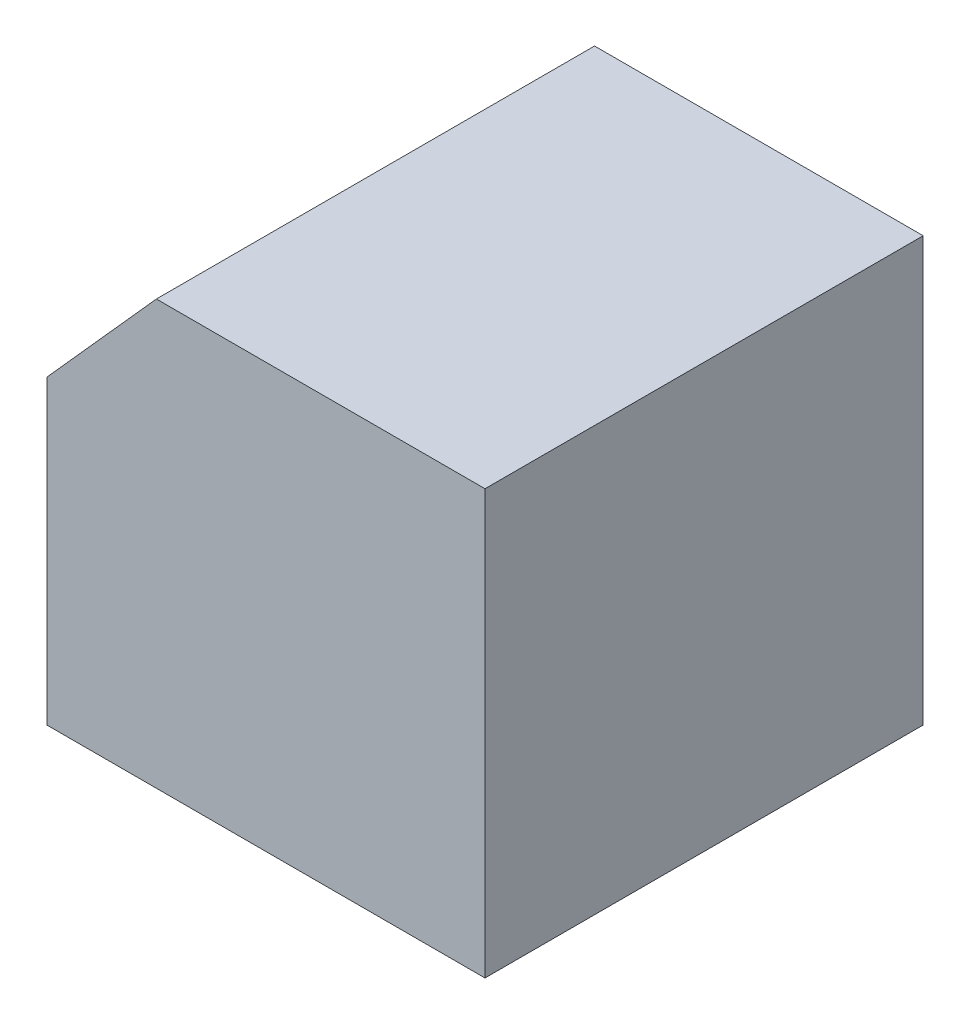
ISO-10303-21;
HEADER;
FILE_DESCRIPTION(('STEP AP214'),'2;1');
FILE_NAME('part.step','',(''),(''),'','','');
FILE_SCHEMA(('AUTOMOTIVE_DESIGN { 1 0 10303 214 1 1 1 1 }'));
ENDSEC;
DATA;
#1=APPLICATION_CONTEXT('core data for automotive mechanical design processes');
#2=APPLICATION_PROTOCOL_DEFINITION('international standard','automotive_design',2000,#1);
#3=PRODUCT_CONTEXT('',#1,'mechanical');
#4=PRODUCT('Part','Part','',(#3));
#5=PRODUCT_RELATED_PRODUCT_CATEGORY('part','',(#4));
#6=PRODUCT_DEFINITION_FORMATION('','',#4);
#7=PRODUCT_DEFINITION_CONTEXT('part definition',#1,'design');
#8=PRODUCT_DEFINITION('design','',#6,#7);
#9=PRODUCT_DEFINITION_SHAPE('','',#8);
#10=(LENGTH_UNIT() NAMED_UNIT(*) SI_UNIT(.MILLI.,.METRE.));
#11=(NAMED_UNIT(*) PLANE_ANGLE_UNIT() SI_UNIT($,.RADIAN.));
#12=(NAMED_UNIT(*) SI_UNIT($,.STERADIAN.) SOLID_ANGLE_UNIT());
#13=UNCERTAINTY_MEASURE_WITH_UNIT(LENGTH_MEASURE(1.E-05),#10,'distance_accuracy_value','');
#14=(GEOMETRIC_REPRESENTATION_CONTEXT(3) GLOBAL_UNCERTAINTY_ASSIGNED_CONTEXT((#13)) GLOBAL_UNIT_ASSIGNED_CONTEXT((#10,
#11,#12)) REPRESENTATION_CONTEXT('',''));
#15=CARTESIAN_POINT('',(0.,0.,0.));
#16=DIRECTION('',(0.,0.,1.));
#17=DIRECTION('',(1.,0.,0.));
#18=AXIS2_PLACEMENT_3D('',#15,#16,#17);
#19=CARTESIAN_POINT('',(101.6,392.992253256989,406.4));
#20=DIRECTION('',(0.74535599249993,-0.666666666666667,0.));
#21=DIRECTION('',(0.666666666666667,0.74535599249993,0.));
#22=AXIS2_PLACEMENT_3D('',#19,#20,#21);
#23=PLANE('',#22);
#24=DIRECTION('',(-0.666666666666667,-0.74535599249993,0.));
#25=VECTOR('',#24,1.);
#26=CARTESIAN_POINT('',(101.6,392.992253256989,0.));
#27=LINE('',#26,#25);
#28=CARTESIAN_POINT('',(101.6,392.992253256989,0.));
#29=VERTEX_POINT('',#28);
#30=CARTESIAN_POINT('',(0.,279.4,0.));
#31=VERTEX_POINT('',#30);
#32=EDGE_CURVE('E107',#29,#31,#27,.T.);
#33=ORIENTED_EDGE('',*,*,#32,.T.);
#34=DIRECTION('',(0.,0.,-1.));
#35=VECTOR('',#34,1.);
#36=CARTESIAN_POINT('',(0.,279.4,406.4));
#37=LINE('',#36,#35);
#38=CARTESIAN_POINT('',(0.,279.4,406.4));
#39=VERTEX_POINT('',#38);
#40=EDGE_CURVE('E11',#39,#31,#37,.T.);
#41=ORIENTED_EDGE('',*,*,#40,.F.);
#42=DIRECTION('',(-0.666666666666667,-0.74535599249993,0.));
#43=VECTOR('',#42,1.);
#44=CARTESIAN_POINT('',(101.6,392.992253256989,406.4));
#45=LINE('',#44,#43);
#46=CARTESIAN_POINT('',(101.6,392.992253256989,406.4));
#47=VERTEX_POINT('',#46);
#48=EDGE_CURVE('E115',#47,#39,#45,.T.);
#49=ORIENTED_EDGE('',*,*,#48,.F.);
#50=DIRECTION('',(0.,0.,-1.));
#51=VECTOR('',#50,1.);
#52=CARTESIAN_POINT('',(101.6,392.992253256989,406.4));
#53=LINE('',#52,#51);
#54=EDGE_CURVE('E103',#47,#29,#53,.T.);
#55=ORIENTED_EDGE('',*,*,#54,.T.);
#56=EDGE_LOOP('',(#33,#41,#49,#55));
#57=FACE_BOUND('',#56,.T.);
#58=ADVANCED_FACE('F33',(#57),#23,.F.);
#59=CARTESIAN_POINT('',(0.,279.4,406.4));
#60=DIRECTION('',(1.,0.,0.));
#61=DIRECTION('',(0.,1.,0.));
#62=AXIS2_PLACEMENT_3D('',#59,#60,#61);
#63=PLANE('',#62);
#64=DIRECTION('',(0.,-1.,0.));
#65=VECTOR('',#64,1.);
#66=CARTESIAN_POINT('',(0.,279.4,0.));
#67=LINE('',#66,#65);
#68=CARTESIAN_POINT('',(0.,0.,0.));
#69=VERTEX_POINT('',#68);
#70=EDGE_CURVE('E110',#31,#69,#67,.T.);
#71=ORIENTED_EDGE('',*,*,#70,.T.);
#72=DIRECTION('',(0.,0.,-1.));
#73=VECTOR('',#72,1.);
#74=CARTESIAN_POINT('',(0.,0.,406.4));
#75=LINE('',#74,#73);
#76=CARTESIAN_POINT('',(0.,0.,406.4));
#77=VERTEX_POINT('',#76);
#78=EDGE_CURVE('E41',#77,#69,#75,.T.);
#79=ORIENTED_EDGE('',*,*,#78,.F.);
#80=DIRECTION('',(0.,-1.,0.));
#81=VECTOR('',#80,1.);
#82=CARTESIAN_POINT('',(0.,279.4,406.4));
#83=LINE('',#82,#81);
#84=EDGE_CURVE('E83',#39,#77,#83,.T.);
#85=ORIENTED_EDGE('',*,*,#84,.F.);
#86=ORIENTED_EDGE('',*,*,#40,.T.);
#87=EDGE_LOOP('',(#71,#79,#85,#86));
#88=FACE_BOUND('',#87,.T.);
#89=ADVANCED_FACE('F134',(#88),#63,.F.);
#90=CARTESIAN_POINT('',(0.,0.,406.4));
#91=DIRECTION('',(0.,1.,0.));
#92=DIRECTION('',(0.,0.,1.));
#93=AXIS2_PLACEMENT_3D('',#90,#91,#92);
#94=PLANE('',#93);
#95=DIRECTION('',(1.,0.,0.));
#96=VECTOR('',#95,1.);
#97=CARTESIAN_POINT('',(0.,0.,0.));
#98=LINE('',#97,#96);
#99=CARTESIAN_POINT('',(406.4,0.,0.));
#100=VERTEX_POINT('',#99);
#101=EDGE_CURVE('E98',#69,#100,#98,.T.);
#102=ORIENTED_EDGE('',*,*,#101,.T.);
#103=DIRECTION('',(0.,0.,-1.));
#104=VECTOR('',#103,1.);
#105=CARTESIAN_POINT('',(406.4,0.,406.4));
#106=LINE('',#105,#104);
#107=CARTESIAN_POINT('',(406.4,0.,406.4));
#108=VERTEX_POINT('',#107);
#109=EDGE_CURVE('E95',#108,#100,#106,.T.);
#110=ORIENTED_EDGE('',*,*,#109,.F.);
#111=DIRECTION('',(1.,0.,0.));
#112=VECTOR('',#111,1.);
#113=CARTESIAN_POINT('',(0.,0.,406.4));
#114=LINE('',#113,#112);
#115=EDGE_CURVE('E87',#77,#108,#114,.T.);
#116=ORIENTED_EDGE('',*,*,#115,.F.);
#117=ORIENTED_EDGE('',*,*,#78,.T.);
#118=EDGE_LOOP('',(#102,#110,#116,#117));
#119=FACE_BOUND('',#118,.T.);
#120=ADVANCED_FACE('F96',(#119),#94,.F.);
#121=CARTESIAN_POINT('',(406.4,0.,406.4));
#122=DIRECTION('',(-1.,0.,0.));
#123=DIRECTION('',(0.,0.,1.));
#124=AXIS2_PLACEMENT_3D('',#121,#122,#123);
#125=PLANE('',#124);
#126=DIRECTION('',(0.,1.,0.));
#127=VECTOR('',#126,1.);
#128=CARTESIAN_POINT('',(406.4,0.,0.));
#129=LINE('',#128,#127);
#130=CARTESIAN_POINT('',(406.4,392.992253256989,0.));
#131=VERTEX_POINT('',#130);
#132=EDGE_CURVE('E69',#100,#131,#129,.T.);
#133=ORIENTED_EDGE('',*,*,#132,.T.);
#134=DIRECTION('',(0.,0.,-1.));
#135=VECTOR('',#134,1.);
#136=CARTESIAN_POINT('',(406.4,392.992253256989,406.4));
#137=LINE('',#136,#135);
#138=CARTESIAN_POINT('',(406.4,392.992253256989,406.4));
#139=VERTEX_POINT('',#138);
#140=EDGE_CURVE('E99',#139,#131,#137,.T.);
#141=ORIENTED_EDGE('',*,*,#140,.F.);
#142=DIRECTION('',(0.,1.,0.));
#143=VECTOR('',#142,1.);
#144=CARTESIAN_POINT('',(406.4,0.,406.4));
#145=LINE('',#144,#143);
#146=EDGE_CURVE('E91',#108,#139,#145,.T.);
#147=ORIENTED_EDGE('',*,*,#146,.F.);
#148=ORIENTED_EDGE('',*,*,#109,.T.);
#149=EDGE_LOOP('',(#133,#141,#147,#148));
#150=FACE_BOUND('',#149,.T.);
#151=ADVANCED_FACE('F101',(#150),#125,.F.);
#152=CARTESIAN_POINT('',(406.4,392.992253256989,406.4));
#153=DIRECTION('',(0.,-1.,0.));
#154=DIRECTION('',(1.,0.,0.));
#155=AXIS2_PLACEMENT_3D('',#152,#153,#154);
#156=PLANE('',#155);
#157=DIRECTION('',(-1.,0.,0.));
#158=VECTOR('',#157,1.);
#159=CARTESIAN_POINT('',(406.4,392.992253256989,0.));
#160=LINE('',#159,#158);
#161=EDGE_CURVE('E75',#131,#29,#160,.T.);
#162=ORIENTED_EDGE('',*,*,#161,.T.);
#163=ORIENTED_EDGE('',*,*,#54,.F.);
#164=DIRECTION('',(-1.,0.,0.));
#165=VECTOR('',#164,1.);
#166=CARTESIAN_POINT('',(406.4,392.992253256989,406.4));
#167=LINE('',#166,#165);
#168=EDGE_CURVE('E49',#139,#47,#167,.T.);
#169=ORIENTED_EDGE('',*,*,#168,.F.);
#170=ORIENTED_EDGE('',*,*,#140,.T.);
#171=EDGE_LOOP('',(#162,#163,#169,#170));
#172=FACE_BOUND('',#171,.T.);
#173=ADVANCED_FACE('F123',(#172),#156,.F.);
#174=CARTESIAN_POINT('',(0.,0.,406.4));
#175=DIRECTION('',(0.,0.,1.));
#176=DIRECTION('',(1.,0.,0.));
#177=AXIS2_PLACEMENT_3D('',#174,#175,#176);
#178=PLANE('',#177);
#179=ORIENTED_EDGE('',*,*,#48,.T.);
#180=ORIENTED_EDGE('',*,*,#84,.T.);
#181=ORIENTED_EDGE('',*,*,#115,.T.);
#182=ORIENTED_EDGE('',*,*,#146,.T.);
#183=ORIENTED_EDGE('',*,*,#168,.T.);
#184=EDGE_LOOP('',(#179,#180,#181,#182,#183));
#185=FACE_BOUND('',#184,.T.);
#186=ADVANCED_FACE('F89',(#185),#178,.T.);
#187=CARTESIAN_POINT('',(0.,0.,0.));
#188=DIRECTION('',(0.,0.,1.));
#189=DIRECTION('',(1.,0.,0.));
#190=AXIS2_PLACEMENT_3D('',#187,#188,#189);
#191=PLANE('',#190);
#192=ORIENTED_EDGE('',*,*,#32,.F.);
#193=ORIENTED_EDGE('',*,*,#161,.F.);
#194=ORIENTED_EDGE('',*,*,#132,.F.);
#195=ORIENTED_EDGE('',*,*,#101,.F.);
#196=ORIENTED_EDGE('',*,*,#70,.F.);
#197=EDGE_LOOP('',(#192,#193,#194,#195,#196));
#198=FACE_BOUND('',#197,.T.);
#199=ADVANCED_FACE('F119',(#198),#191,.F.);
#200=CLOSED_SHELL('',(#58,#89,#120,#151,#173,#186,#199));
#201=MANIFOLD_SOLID_BREP('B2',#200);
#202=ADVANCED_BREP_SHAPE_REPRESENTATION('',(#18,#201),#14);
#203=SHAPE_DEFINITION_REPRESENTATION(#9,#202);
ENDSEC;
END-ISO-10303-21;
